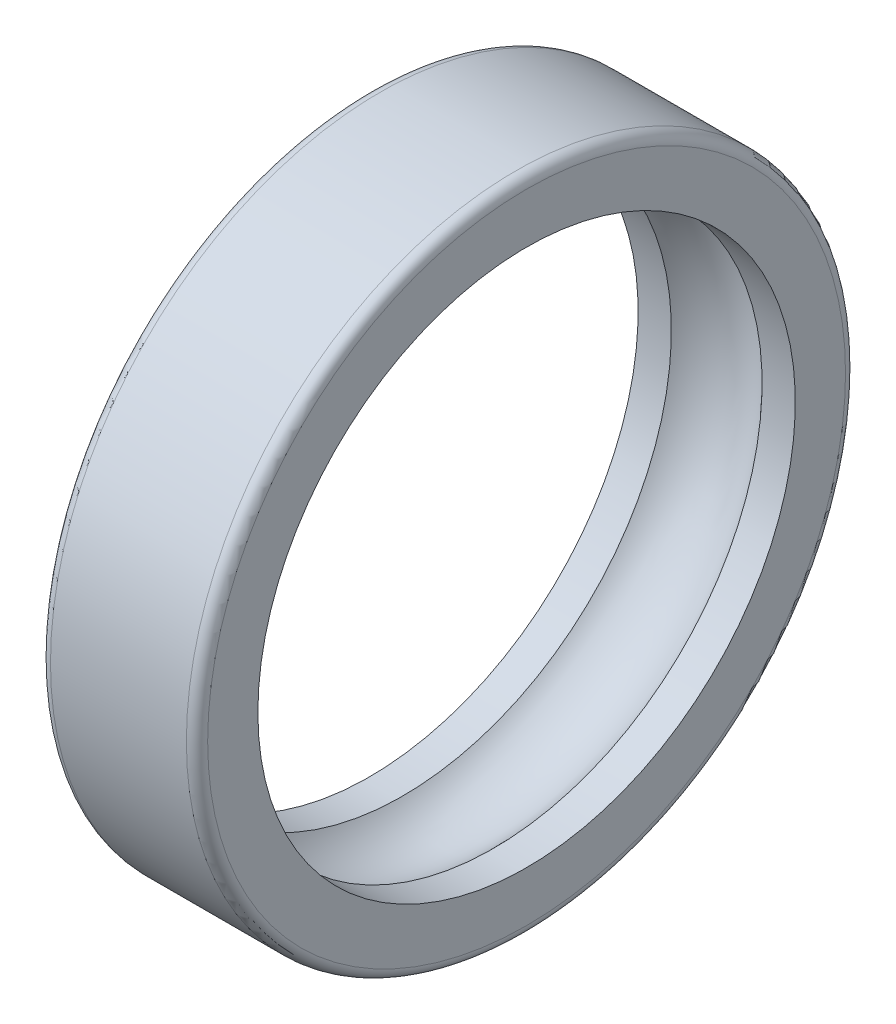
ISO-10303-21;
HEADER;
FILE_DESCRIPTION(('STEP AP214'),'2;1');
FILE_NAME('part.step','',(''),(''),'','','');
FILE_SCHEMA(('AUTOMOTIVE_DESIGN { 1 0 10303 214 1 1 1 1 }'));
ENDSEC;
DATA;
#1=APPLICATION_CONTEXT('core data for automotive mechanical design processes');
#2=APPLICATION_PROTOCOL_DEFINITION('international standard','automotive_design',2000,#1);
#3=PRODUCT_CONTEXT('',#1,'mechanical');
#4=PRODUCT('Part','Part','',(#3));
#5=PRODUCT_RELATED_PRODUCT_CATEGORY('part','',(#4));
#6=PRODUCT_DEFINITION_FORMATION('','',#4);
#7=PRODUCT_DEFINITION_CONTEXT('part definition',#1,'design');
#8=PRODUCT_DEFINITION('design','',#6,#7);
#9=PRODUCT_DEFINITION_SHAPE('','',#8);
#10=(LENGTH_UNIT() NAMED_UNIT(*) SI_UNIT(.MILLI.,.METRE.));
#11=(NAMED_UNIT(*) PLANE_ANGLE_UNIT() SI_UNIT($,.RADIAN.));
#12=(NAMED_UNIT(*) SI_UNIT($,.STERADIAN.) SOLID_ANGLE_UNIT());
#13=UNCERTAINTY_MEASURE_WITH_UNIT(LENGTH_MEASURE(1.E-05),#10,'distance_accuracy_value','');
#14=(GEOMETRIC_REPRESENTATION_CONTEXT(3) GLOBAL_UNCERTAINTY_ASSIGNED_CONTEXT((#13)) GLOBAL_UNIT_ASSIGNED_CONTEXT((#10,
#11,#12)) REPRESENTATION_CONTEXT('',''));
#15=CARTESIAN_POINT('',(0.,0.,0.));
#16=DIRECTION('',(0.,0.,1.));
#17=DIRECTION('',(1.,0.,0.));
#18=AXIS2_PLACEMENT_3D('',#15,#16,#17);
#19=CARTESIAN_POINT('',(15.5,53.,0.));
#20=DIRECTION('',(-1.,0.,0.));
#21=DIRECTION('',(0.,0.,1.));
#22=AXIS2_PLACEMENT_3D('',#19,#20,#21);
#23=PLANE('',#22);
#24=CARTESIAN_POINT('',(15.5,0.,0.));
#25=DIRECTION('',(-1.,0.,0.));
#26=DIRECTION('',(0.,0.,1.));
#27=AXIS2_PLACEMENT_3D('',#24,#25,#26);
#28=CIRCLE('',#27,62.9);
#29=CARTESIAN_POINT('',(15.5,0.,62.9));
#30=VERTEX_POINT('',#29);
#31=EDGE_CURVE('E38',#30,#30,#28,.F.);
#32=ORIENTED_EDGE('',*,*,#31,.T.);
#33=EDGE_LOOP('',(#32));
#34=FACE_BOUND('',#33,.T.);
#35=CARTESIAN_POINT('',(15.5,0.,0.));
#36=DIRECTION('',(-1.,0.,0.));
#37=DIRECTION('',(0.,0.,1.));
#38=AXIS2_PLACEMENT_3D('',#35,#36,#37);
#39=CIRCLE('',#38,53.);
#40=CARTESIAN_POINT('',(15.5,0.,53.));
#41=VERTEX_POINT('',#40);
#42=EDGE_CURVE('E51',#41,#41,#39,.T.);
#43=ORIENTED_EDGE('',*,*,#42,.T.);
#44=EDGE_LOOP('',(#43));
#45=FACE_BOUND('',#44,.T.);
#46=ADVANCED_FACE('F31',(#34,#45),#23,.F.);
#47=CARTESIAN_POINT('',(-12.3345070422535,0.,0.));
#48=DIRECTION('',(-1.,0.,0.));
#49=DIRECTION('',(0.,0.,1.));
#50=AXIS2_PLACEMENT_3D('',#47,#48,#49);
#51=CYLINDRICAL_SURFACE('',#50,53.);
#52=ORIENTED_EDGE('',*,*,#42,.F.);
#53=EDGE_LOOP('',(#52));
#54=FACE_BOUND('',#53,.T.);
#55=CARTESIAN_POINT('',(8.94427190999916,0.,0.));
#56=DIRECTION('',(-1.,0.,0.));
#57=DIRECTION('',(0.,0.,1.));
#58=AXIS2_PLACEMENT_3D('',#55,#56,#57);
#59=CIRCLE('',#58,53.);
#60=CARTESIAN_POINT('',(8.94427190999916,0.,53.));
#61=VERTEX_POINT('',#60);
#62=EDGE_CURVE('E54',#61,#61,#59,.T.);
#63=ORIENTED_EDGE('',*,*,#62,.T.);
#64=EDGE_LOOP('',(#63));
#65=FACE_BOUND('',#64,.T.);
#66=ADVANCED_FACE('F81',(#54,#65),#51,.F.);
#67=CARTESIAN_POINT('',(0.,0.,0.));
#68=DIRECTION('',(-1.,0.,0.));
#69=DIRECTION('',(0.,0.,1.));
#70=AXIS2_PLACEMENT_3D('',#67,#68,#69);
#71=TOROIDAL_SURFACE('',#70,45.,12.);
#72=ORIENTED_EDGE('',*,*,#62,.F.);
#73=EDGE_LOOP('',(#72));
#74=FACE_BOUND('',#73,.T.);
#75=CARTESIAN_POINT('',(-8.94427190999916,0.,0.));
#76=DIRECTION('',(-1.,0.,0.));
#77=DIRECTION('',(0.,0.,1.));
#78=AXIS2_PLACEMENT_3D('',#75,#76,#77);
#79=CIRCLE('',#78,53.);
#80=CARTESIAN_POINT('',(-8.94427190999916,0.,53.));
#81=VERTEX_POINT('',#80);
#82=EDGE_CURVE('E57',#81,#81,#79,.T.);
#83=ORIENTED_EDGE('',*,*,#82,.T.);
#84=EDGE_LOOP('',(#83));
#85=FACE_BOUND('',#84,.T.);
#86=ADVANCED_FACE('F77',(#74,#85),#71,.F.);
#87=CARTESIAN_POINT('',(-12.3345070422535,0.,0.));
#88=DIRECTION('',(-1.,0.,0.));
#89=DIRECTION('',(0.,0.,1.));
#90=AXIS2_PLACEMENT_3D('',#87,#88,#89);
#91=CYLINDRICAL_SURFACE('',#90,53.);
#92=ORIENTED_EDGE('',*,*,#82,.F.);
#93=EDGE_LOOP('',(#92));
#94=FACE_BOUND('',#93,.T.);
#95=CARTESIAN_POINT('',(-15.5,0.,0.));
#96=DIRECTION('',(-1.,0.,0.));
#97=DIRECTION('',(0.,0.,1.));
#98=AXIS2_PLACEMENT_3D('',#95,#96,#97);
#99=CIRCLE('',#98,53.);
#100=CARTESIAN_POINT('',(-15.5,0.,53.));
#101=VERTEX_POINT('',#100);
#102=EDGE_CURVE('E60',#101,#101,#99,.T.);
#103=ORIENTED_EDGE('',*,*,#102,.T.);
#104=EDGE_LOOP('',(#103));
#105=FACE_BOUND('',#104,.T.);
#106=ADVANCED_FACE('F64',(#94,#105),#91,.F.);
#107=CARTESIAN_POINT('',(-15.5,53.,0.));
#108=DIRECTION('',(1.,0.,0.));
#109=DIRECTION('',(0.,0.,-1.));
#110=AXIS2_PLACEMENT_3D('',#107,#108,#109);
#111=PLANE('',#110);
#112=CARTESIAN_POINT('',(-15.5,0.,0.));
#113=DIRECTION('',(1.,0.,0.));
#114=DIRECTION('',(0.,0.,-1.));
#115=AXIS2_PLACEMENT_3D('',#112,#113,#114);
#116=CIRCLE('',#115,62.9);
#117=CARTESIAN_POINT('',(-15.5,0.,-62.9));
#118=VERTEX_POINT('',#117);
#119=EDGE_CURVE('E10',#118,#118,#116,.F.);
#120=ORIENTED_EDGE('',*,*,#119,.T.);
#121=EDGE_LOOP('',(#120));
#122=FACE_BOUND('',#121,.T.);
#123=ORIENTED_EDGE('',*,*,#102,.F.);
#124=EDGE_LOOP('',(#123));
#125=FACE_BOUND('',#124,.T.);
#126=ADVANCED_FACE('F66',(#122,#125),#111,.F.);
#127=CARTESIAN_POINT('',(-12.3345070422535,0.,0.));
#128=DIRECTION('',(-1.,0.,0.));
#129=DIRECTION('',(0.,0.,1.));
#130=AXIS2_PLACEMENT_3D('',#127,#128,#129);
#131=CYLINDRICAL_SURFACE('',#130,65.);
#132=CARTESIAN_POINT('',(13.4,0.,0.));
#133=DIRECTION('',(-1.,0.,0.));
#134=DIRECTION('',(0.,0.,1.));
#135=AXIS2_PLACEMENT_3D('',#132,#133,#134);
#136=CIRCLE('',#135,65.);
#137=CARTESIAN_POINT('',(13.4,0.,65.));
#138=VERTEX_POINT('',#137);
#139=EDGE_CURVE('E42',#138,#138,#136,.T.);
#140=ORIENTED_EDGE('',*,*,#139,.T.);
#141=EDGE_LOOP('',(#140));
#142=FACE_BOUND('',#141,.T.);
#143=CARTESIAN_POINT('',(-13.4,0.,0.));
#144=DIRECTION('',(1.,0.,0.));
#145=DIRECTION('',(0.,0.,-1.));
#146=AXIS2_PLACEMENT_3D('',#143,#144,#145);
#147=CIRCLE('',#146,65.);
#148=CARTESIAN_POINT('',(-13.4,0.,-65.));
#149=VERTEX_POINT('',#148);
#150=EDGE_CURVE('E46',#149,#149,#147,.T.);
#151=ORIENTED_EDGE('',*,*,#150,.T.);
#152=EDGE_LOOP('',(#151));
#153=FACE_BOUND('',#152,.T.);
#154=ADVANCED_FACE('F68',(#142,#153),#131,.T.);
#155=CARTESIAN_POINT('',(13.4,0.,0.));
#156=DIRECTION('',(-1.,0.,0.));
#157=DIRECTION('',(0.,0.,1.));
#158=AXIS2_PLACEMENT_3D('',#155,#156,#157);
#159=TOROIDAL_SURFACE('',#158,62.9,2.1);
#160=ORIENTED_EDGE('',*,*,#31,.F.);
#161=EDGE_LOOP('',(#160));
#162=FACE_BOUND('',#161,.T.);
#163=ORIENTED_EDGE('',*,*,#139,.F.);
#164=EDGE_LOOP('',(#163));
#165=FACE_BOUND('',#164,.T.);
#166=ADVANCED_FACE('F74',(#162,#165),#159,.T.);
#167=CARTESIAN_POINT('',(-13.4,0.,0.));
#168=DIRECTION('',(1.,0.,0.));
#169=DIRECTION('',(0.,0.,-1.));
#170=AXIS2_PLACEMENT_3D('',#167,#168,#169);
#171=TOROIDAL_SURFACE('',#170,62.9,2.1);
#172=ORIENTED_EDGE('',*,*,#150,.F.);
#173=EDGE_LOOP('',(#172));
#174=FACE_BOUND('',#173,.T.);
#175=ORIENTED_EDGE('',*,*,#119,.F.);
#176=EDGE_LOOP('',(#175));
#177=FACE_BOUND('',#176,.T.);
#178=ADVANCED_FACE('F33',(#174,#177),#171,.T.);
#179=CLOSED_SHELL('',(#46,#66,#86,#106,#126,#154,#166,#178));
#180=MANIFOLD_SOLID_BREP('B2',#179);
#181=ADVANCED_BREP_SHAPE_REPRESENTATION('',(#18,#180),#14);
#182=SHAPE_DEFINITION_REPRESENTATION(#9,#181);
ENDSEC;
END-ISO-10303-21;
